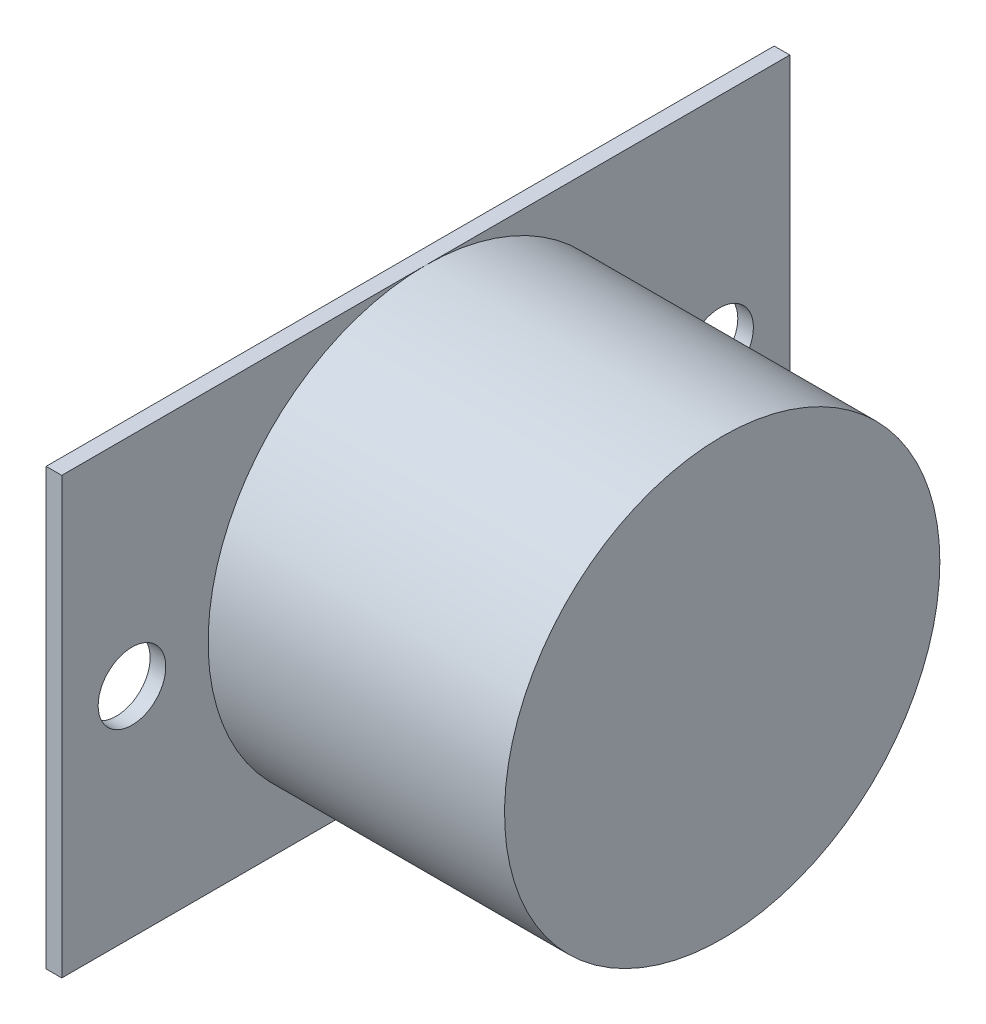
ISO-10303-21;
HEADER;
FILE_DESCRIPTION(('STEP AP214'),'2;1');
FILE_NAME('part.step','',(''),(''),'','','');
FILE_SCHEMA(('AUTOMOTIVE_DESIGN { 1 0 10303 214 1 1 1 1 }'));
ENDSEC;
DATA;
#1=APPLICATION_CONTEXT('core data for automotive mechanical design processes');
#2=APPLICATION_PROTOCOL_DEFINITION('international standard','automotive_design',2000,#1);
#3=PRODUCT_CONTEXT('',#1,'mechanical');
#4=PRODUCT('Part','Part','',(#3));
#5=PRODUCT_RELATED_PRODUCT_CATEGORY('part','',(#4));
#6=PRODUCT_DEFINITION_FORMATION('','',#4);
#7=PRODUCT_DEFINITION_CONTEXT('part definition',#1,'design');
#8=PRODUCT_DEFINITION('design','',#6,#7);
#9=PRODUCT_DEFINITION_SHAPE('','',#8);
#10=(LENGTH_UNIT() NAMED_UNIT(*) SI_UNIT(.MILLI.,.METRE.));
#11=(NAMED_UNIT(*) PLANE_ANGLE_UNIT() SI_UNIT($,.RADIAN.));
#12=(NAMED_UNIT(*) SI_UNIT($,.STERADIAN.) SOLID_ANGLE_UNIT());
#13=UNCERTAINTY_MEASURE_WITH_UNIT(LENGTH_MEASURE(1.E-05),#10,'distance_accuracy_value','');
#14=(GEOMETRIC_REPRESENTATION_CONTEXT(3) GLOBAL_UNCERTAINTY_ASSIGNED_CONTEXT((#13)) GLOBAL_UNIT_ASSIGNED_CONTEXT((#10,
#11,#12)) REPRESENTATION_CONTEXT('',''));
#15=CARTESIAN_POINT('',(0.,0.,0.));
#16=DIRECTION('',(0.,0.,1.));
#17=DIRECTION('',(1.,0.,0.));
#18=AXIS2_PLACEMENT_3D('',#15,#16,#17);
#19=CARTESIAN_POINT('',(30.,0.,0.));
#20=DIRECTION('',(-1.,0.,0.));
#21=DIRECTION('',(0.,0.,1.));
#22=AXIS2_PLACEMENT_3D('',#19,#20,#21);
#23=CYLINDRICAL_SURFACE('',#22,20.926913158788);
#24=CARTESIAN_POINT('',(1.5,0.,0.));
#25=DIRECTION('',(1.,0.,0.));
#26=DIRECTION('',(0.,0.,-1.));
#27=AXIS2_PLACEMENT_3D('',#24,#25,#26);
#28=CIRCLE('',#27,20.926913158788);
#29=CARTESIAN_POINT('',(1.5,-20.926913158788,0.));
#30=VERTEX_POINT('',#29);
#31=CARTESIAN_POINT('',(1.5,20.926913158788,0.));
#32=VERTEX_POINT('',#31);
#33=EDGE_CURVE('E48',#30,#32,#28,.T.);
#34=ORIENTED_EDGE('',*,*,#33,.T.);
#35=EDGE_CURVE('E11',#32,#30,#28,.T.);
#36=ORIENTED_EDGE('',*,*,#35,.T.);
#37=EDGE_LOOP('',(#34,#36));
#38=FACE_BOUND('',#37,.T.);
#39=CARTESIAN_POINT('',(30.,0.,0.));
#40=DIRECTION('',(1.,0.,0.));
#41=DIRECTION('',(0.,0.,-1.));
#42=AXIS2_PLACEMENT_3D('',#39,#40,#41);
#43=CIRCLE('',#42,20.926913158788);
#44=CARTESIAN_POINT('',(30.,0.,-20.926913158788));
#45=VERTEX_POINT('',#44);
#46=EDGE_CURVE('E114',#45,#45,#43,.T.);
#47=ORIENTED_EDGE('',*,*,#46,.F.);
#48=EDGE_LOOP('',(#47));
#49=FACE_BOUND('',#48,.T.);
#50=ADVANCED_FACE('F45',(#38,#49),#23,.T.);
#51=CARTESIAN_POINT('',(30.,0.,0.));
#52=DIRECTION('',(1.,0.,0.));
#53=DIRECTION('',(0.,0.,-1.));
#54=AXIS2_PLACEMENT_3D('',#51,#52,#53);
#55=PLANE('',#54);
#56=ORIENTED_EDGE('',*,*,#46,.T.);
#57=EDGE_LOOP('',(#56));
#58=FACE_BOUND('',#57,.T.);
#59=ADVANCED_FACE('F192',(#58),#55,.T.);
#60=CARTESIAN_POINT('',(1.5,0.,0.));
#61=DIRECTION('',(1.,0.,0.));
#62=DIRECTION('',(0.,0.,-1.));
#63=AXIS2_PLACEMENT_3D('',#60,#61,#62);
#64=PLANE('',#63);
#65=CARTESIAN_POINT('',(1.5,0.,28.25));
#66=DIRECTION('',(-1.,0.,0.));
#67=DIRECTION('',(0.,0.,1.));
#68=AXIS2_PLACEMENT_3D('',#65,#66,#67);
#69=CIRCLE('',#68,3.25);
#70=CARTESIAN_POINT('',(1.5,0.,31.5));
#71=VERTEX_POINT('',#70);
#72=EDGE_CURVE('E141',#71,#71,#69,.T.);
#73=ORIENTED_EDGE('',*,*,#72,.T.);
#74=EDGE_LOOP('',(#73));
#75=FACE_BOUND('',#74,.T.);
#76=ORIENTED_EDGE('',*,*,#35,.F.);
#77=DIRECTION('',(0.,0.,1.));
#78=VECTOR('',#77,1.);
#79=CARTESIAN_POINT('',(1.5,20.926913158788,-35.));
#80=LINE('',#79,#78);
#81=CARTESIAN_POINT('',(1.5,20.926913158788,35.));
#82=VERTEX_POINT('',#81);
#83=EDGE_CURVE('E95',#32,#82,#80,.T.);
#84=ORIENTED_EDGE('',*,*,#83,.T.);
#85=DIRECTION('',(0.,1.,0.));
#86=VECTOR('',#85,1.);
#87=CARTESIAN_POINT('',(1.5,-20.926913158788,35.));
#88=LINE('',#87,#86);
#89=CARTESIAN_POINT('',(1.5,-20.926913158788,35.));
#90=VERTEX_POINT('',#89);
#91=EDGE_CURVE('E98',#90,#82,#88,.T.);
#92=ORIENTED_EDGE('',*,*,#91,.F.);
#93=DIRECTION('',(0.,0.,1.));
#94=VECTOR('',#93,1.);
#95=CARTESIAN_POINT('',(1.5,-20.926913158788,-35.));
#96=LINE('',#95,#94);
#97=EDGE_CURVE('E144',#30,#90,#96,.T.);
#98=ORIENTED_EDGE('',*,*,#97,.F.);
#99=EDGE_LOOP('',(#76,#84,#92,#98));
#100=FACE_BOUND('',#99,.T.);
#101=ADVANCED_FACE('F164',(#75,#100),#64,.T.);
#102=CARTESIAN_POINT('',(1.5,20.926913158788,-35.));
#103=DIRECTION('',(0.,-1.,0.));
#104=DIRECTION('',(0.,0.,-1.));
#105=AXIS2_PLACEMENT_3D('',#102,#103,#104);
#106=PLANE('',#105);
#107=ORIENTED_EDGE('',*,*,#83,.F.);
#108=CARTESIAN_POINT('',(1.5,20.926913158788,-35.));
#109=VERTEX_POINT('',#108);
#110=EDGE_CURVE('E60',#109,#32,#80,.T.);
#111=ORIENTED_EDGE('',*,*,#110,.F.);
#112=DIRECTION('',(-1.,0.,0.));
#113=VECTOR('',#112,1.);
#114=CARTESIAN_POINT('',(1.5,20.926913158788,-35.));
#115=LINE('',#114,#113);
#116=CARTESIAN_POINT('',(0.,20.926913158788,-35.));
#117=VERTEX_POINT('',#116);
#118=EDGE_CURVE('E92',#109,#117,#115,.T.);
#119=ORIENTED_EDGE('',*,*,#118,.T.);
#120=DIRECTION('',(0.,0.,1.));
#121=VECTOR('',#120,1.);
#122=CARTESIAN_POINT('',(0.,20.926913158788,-35.));
#123=LINE('',#122,#121);
#124=CARTESIAN_POINT('',(0.,20.926913158788,35.));
#125=VERTEX_POINT('',#124);
#126=EDGE_CURVE('E136',#117,#125,#123,.T.);
#127=ORIENTED_EDGE('',*,*,#126,.T.);
#128=DIRECTION('',(-1.,0.,0.));
#129=VECTOR('',#128,1.);
#130=CARTESIAN_POINT('',(1.5,20.926913158788,35.));
#131=LINE('',#130,#129);
#132=EDGE_CURVE('E115',#82,#125,#131,.T.);
#133=ORIENTED_EDGE('',*,*,#132,.F.);
#134=EDGE_LOOP('',(#107,#111,#119,#127,#133));
#135=FACE_BOUND('',#134,.T.);
#136=ADVANCED_FACE('F90',(#135),#106,.F.);
#137=CARTESIAN_POINT('',(1.5,-20.926913158788,-35.));
#138=DIRECTION('',(0.,-1.,0.));
#139=DIRECTION('',(0.,0.,-1.));
#140=AXIS2_PLACEMENT_3D('',#137,#138,#139);
#141=PLANE('',#140);
#142=DIRECTION('',(0.,0.,1.));
#143=VECTOR('',#142,1.);
#144=CARTESIAN_POINT('',(0.,-20.926913158788,-35.));
#145=LINE('',#144,#143);
#146=CARTESIAN_POINT('',(0.,-20.926913158788,-35.));
#147=VERTEX_POINT('',#146);
#148=CARTESIAN_POINT('',(0.,-20.926913158788,35.));
#149=VERTEX_POINT('',#148);
#150=EDGE_CURVE('E108',#147,#149,#145,.T.);
#151=ORIENTED_EDGE('',*,*,#150,.F.);
#152=DIRECTION('',(-1.,0.,0.));
#153=VECTOR('',#152,1.);
#154=CARTESIAN_POINT('',(1.5,-20.926913158788,-35.));
#155=LINE('',#154,#153);
#156=CARTESIAN_POINT('',(1.5,-20.926913158788,-35.));
#157=VERTEX_POINT('',#156);
#158=EDGE_CURVE('E127',#157,#147,#155,.T.);
#159=ORIENTED_EDGE('',*,*,#158,.F.);
#160=EDGE_CURVE('E104',#157,#30,#96,.T.);
#161=ORIENTED_EDGE('',*,*,#160,.T.);
#162=ORIENTED_EDGE('',*,*,#97,.T.);
#163=DIRECTION('',(-1.,0.,0.));
#164=VECTOR('',#163,1.);
#165=CARTESIAN_POINT('',(1.5,-20.926913158788,35.));
#166=LINE('',#165,#164);
#167=EDGE_CURVE('E121',#90,#149,#166,.T.);
#168=ORIENTED_EDGE('',*,*,#167,.T.);
#169=EDGE_LOOP('',(#151,#159,#161,#162,#168));
#170=FACE_BOUND('',#169,.T.);
#171=ADVANCED_FACE('F187',(#170),#141,.T.);
#172=CARTESIAN_POINT('',(1.5,-20.926913158788,-35.));
#173=DIRECTION('',(0.,0.,1.));
#174=DIRECTION('',(1.,0.,0.));
#175=AXIS2_PLACEMENT_3D('',#172,#173,#174);
#176=PLANE('',#175);
#177=DIRECTION('',(0.,1.,0.));
#178=VECTOR('',#177,1.);
#179=CARTESIAN_POINT('',(0.,-20.926913158788,-35.));
#180=LINE('',#179,#178);
#181=EDGE_CURVE('E112',#147,#117,#180,.T.);
#182=ORIENTED_EDGE('',*,*,#181,.T.);
#183=ORIENTED_EDGE('',*,*,#118,.F.);
#184=DIRECTION('',(0.,1.,0.));
#185=VECTOR('',#184,1.);
#186=CARTESIAN_POINT('',(1.5,-20.926913158788,-35.));
#187=LINE('',#186,#185);
#188=EDGE_CURVE('E101',#157,#109,#187,.T.);
#189=ORIENTED_EDGE('',*,*,#188,.F.);
#190=ORIENTED_EDGE('',*,*,#158,.T.);
#191=EDGE_LOOP('',(#182,#183,#189,#190));
#192=FACE_BOUND('',#191,.T.);
#193=ADVANCED_FACE('F110',(#192),#176,.F.);
#194=CARTESIAN_POINT('',(1.5,-20.926913158788,35.));
#195=DIRECTION('',(0.,0.,1.));
#196=DIRECTION('',(1.,0.,0.));
#197=AXIS2_PLACEMENT_3D('',#194,#195,#196);
#198=PLANE('',#197);
#199=DIRECTION('',(0.,1.,0.));
#200=VECTOR('',#199,1.);
#201=CARTESIAN_POINT('',(0.,-20.926913158788,35.));
#202=LINE('',#201,#200);
#203=EDGE_CURVE('E132',#149,#125,#202,.T.);
#204=ORIENTED_EDGE('',*,*,#203,.F.);
#205=ORIENTED_EDGE('',*,*,#167,.F.);
#206=ORIENTED_EDGE('',*,*,#91,.T.);
#207=ORIENTED_EDGE('',*,*,#132,.T.);
#208=EDGE_LOOP('',(#204,#205,#206,#207));
#209=FACE_BOUND('',#208,.T.);
#210=ADVANCED_FACE('F181',(#209),#198,.T.);
#211=CARTESIAN_POINT('',(1.5,0.,-28.25));
#212=DIRECTION('',(-1.,0.,0.));
#213=DIRECTION('',(0.,0.,-1.));
#214=AXIS2_PLACEMENT_3D('',#211,#212,#213);
#215=CIRCLE('',#214,3.25);
#216=CARTESIAN_POINT('',(1.5,0.,-31.5));
#217=VERTEX_POINT('',#216);
#218=EDGE_CURVE('E148',#217,#217,#215,.T.);
#219=ORIENTED_EDGE('',*,*,#218,.T.);
#220=EDGE_LOOP('',(#219));
#221=FACE_BOUND('',#220,.T.);
#222=ORIENTED_EDGE('',*,*,#33,.F.);
#223=ORIENTED_EDGE('',*,*,#160,.F.);
#224=ORIENTED_EDGE('',*,*,#188,.T.);
#225=ORIENTED_EDGE('',*,*,#110,.T.);
#226=EDGE_LOOP('',(#222,#223,#224,#225));
#227=FACE_BOUND('',#226,.T.);
#228=ADVANCED_FACE('F102',(#221,#227),#64,.T.);
#229=CARTESIAN_POINT('',(0.,0.,0.));
#230=DIRECTION('',(1.,0.,0.));
#231=DIRECTION('',(0.,0.,-1.));
#232=AXIS2_PLACEMENT_3D('',#229,#230,#231);
#233=PLANE('',#232);
#234=CARTESIAN_POINT('',(0.,0.,28.25));
#235=DIRECTION('',(-1.,0.,0.));
#236=DIRECTION('',(0.,0.,1.));
#237=AXIS2_PLACEMENT_3D('',#234,#235,#236);
#238=CIRCLE('',#237,3.25);
#239=CARTESIAN_POINT('',(0.,0.,31.5));
#240=VERTEX_POINT('',#239);
#241=EDGE_CURVE('E156',#240,#240,#238,.T.);
#242=ORIENTED_EDGE('',*,*,#241,.F.);
#243=EDGE_LOOP('',(#242));
#244=FACE_BOUND('',#243,.T.);
#245=CARTESIAN_POINT('',(0.,0.,-28.25));
#246=DIRECTION('',(-1.,0.,0.));
#247=DIRECTION('',(0.,0.,-1.));
#248=AXIS2_PLACEMENT_3D('',#245,#246,#247);
#249=CIRCLE('',#248,3.25);
#250=CARTESIAN_POINT('',(0.,0.,-31.5));
#251=VERTEX_POINT('',#250);
#252=EDGE_CURVE('E152',#251,#251,#249,.T.);
#253=ORIENTED_EDGE('',*,*,#252,.F.);
#254=EDGE_LOOP('',(#253));
#255=FACE_BOUND('',#254,.T.);
#256=ORIENTED_EDGE('',*,*,#181,.F.);
#257=ORIENTED_EDGE('',*,*,#150,.T.);
#258=ORIENTED_EDGE('',*,*,#203,.T.);
#259=ORIENTED_EDGE('',*,*,#126,.F.);
#260=EDGE_LOOP('',(#256,#257,#258,#259));
#261=FACE_BOUND('',#260,.T.);
#262=ADVANCED_FACE('F174',(#244,#255,#261),#233,.F.);
#263=CARTESIAN_POINT('',(1.5,0.,-28.25));
#264=DIRECTION('',(-1.,0.,0.));
#265=DIRECTION('',(0.,0.,1.));
#266=AXIS2_PLACEMENT_3D('',#263,#264,#265);
#267=CYLINDRICAL_SURFACE('',#266,3.25);
#268=ORIENTED_EDGE('',*,*,#218,.F.);
#269=EDGE_LOOP('',(#268));
#270=FACE_BOUND('',#269,.T.);
#271=ORIENTED_EDGE('',*,*,#252,.T.);
#272=EDGE_LOOP('',(#271));
#273=FACE_BOUND('',#272,.T.);
#274=ADVANCED_FACE('F170',(#270,#273),#267,.F.);
#275=CARTESIAN_POINT('',(1.5,0.,28.25));
#276=DIRECTION('',(-1.,0.,0.));
#277=DIRECTION('',(0.,0.,1.));
#278=AXIS2_PLACEMENT_3D('',#275,#276,#277);
#279=CYLINDRICAL_SURFACE('',#278,3.25);
#280=ORIENTED_EDGE('',*,*,#72,.F.);
#281=EDGE_LOOP('',(#280));
#282=FACE_BOUND('',#281,.T.);
#283=ORIENTED_EDGE('',*,*,#241,.T.);
#284=EDGE_LOOP('',(#283));
#285=FACE_BOUND('',#284,.T.);
#286=ADVANCED_FACE('F167',(#282,#285),#279,.F.);
#287=CLOSED_SHELL('',(#50,#59,#101,#136,#171,#193,#210,#228,#262,#274,#286));
#288=MANIFOLD_SOLID_BREP('B2',#287);
#289=ADVANCED_BREP_SHAPE_REPRESENTATION('',(#18,#288),#14);
#290=SHAPE_DEFINITION_REPRESENTATION(#9,#289);
ENDSEC;
END-ISO-10303-21;
